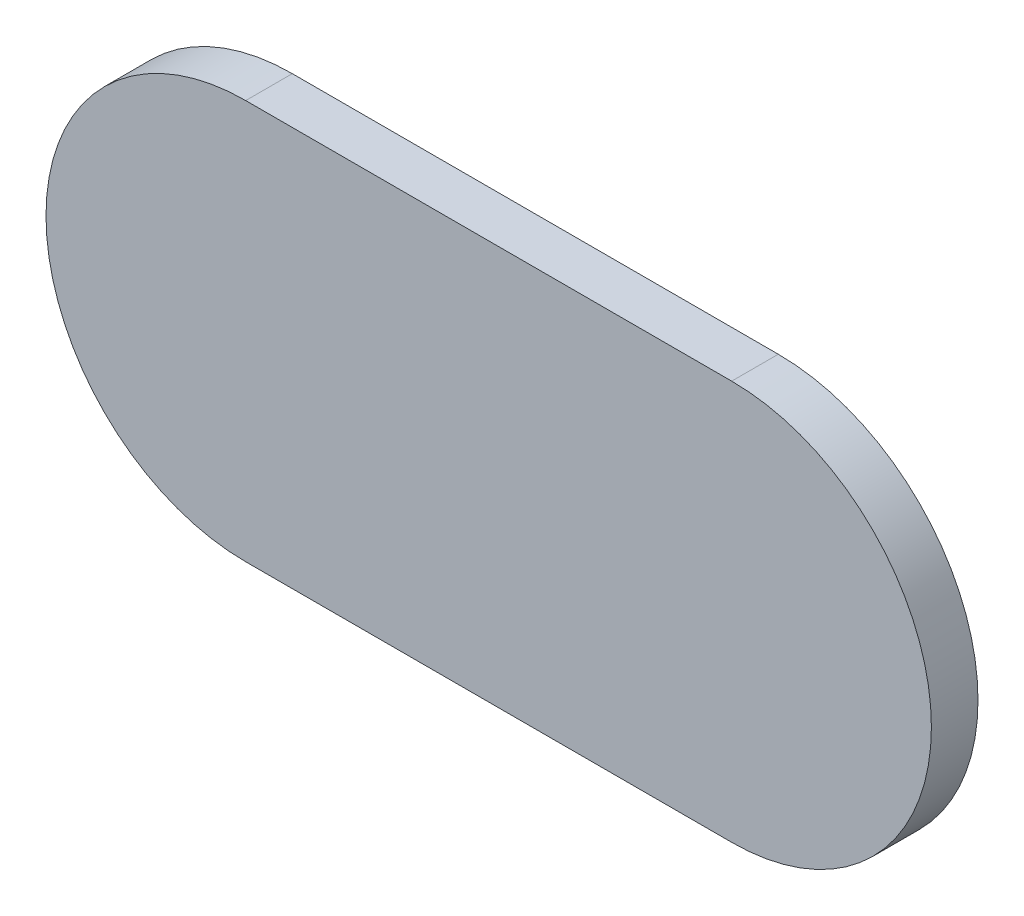
ISO-10303-21;
HEADER;
FILE_DESCRIPTION(('STEP AP214'),'2;1');
FILE_NAME('part.step','',(''),(''),'','','');
FILE_SCHEMA(('AUTOMOTIVE_DESIGN { 1 0 10303 214 1 1 1 1 }'));
ENDSEC;
DATA;
#1=APPLICATION_CONTEXT('core data for automotive mechanical design processes');
#2=APPLICATION_PROTOCOL_DEFINITION('international standard','automotive_design',2000,#1);
#3=PRODUCT_CONTEXT('',#1,'mechanical');
#4=PRODUCT('Part','Part','',(#3));
#5=PRODUCT_RELATED_PRODUCT_CATEGORY('part','',(#4));
#6=PRODUCT_DEFINITION_FORMATION('','',#4);
#7=PRODUCT_DEFINITION_CONTEXT('part definition',#1,'design');
#8=PRODUCT_DEFINITION('design','',#6,#7);
#9=PRODUCT_DEFINITION_SHAPE('','',#8);
#10=(LENGTH_UNIT() NAMED_UNIT(*) SI_UNIT(.MILLI.,.METRE.));
#11=(NAMED_UNIT(*) PLANE_ANGLE_UNIT() SI_UNIT($,.RADIAN.));
#12=(NAMED_UNIT(*) SI_UNIT($,.STERADIAN.) SOLID_ANGLE_UNIT());
#13=UNCERTAINTY_MEASURE_WITH_UNIT(LENGTH_MEASURE(1.E-05),#10,'distance_accuracy_value','');
#14=(GEOMETRIC_REPRESENTATION_CONTEXT(3) GLOBAL_UNCERTAINTY_ASSIGNED_CONTEXT((#13)) GLOBAL_UNIT_ASSIGNED_CONTEXT((#10,
#11,#12)) REPRESENTATION_CONTEXT('',''));
#15=CARTESIAN_POINT('',(0.,0.,0.));
#16=DIRECTION('',(0.,0.,1.));
#17=DIRECTION('',(1.,0.,0.));
#18=AXIS2_PLACEMENT_3D('',#15,#16,#17);
#19=CARTESIAN_POINT('',(85.365,-131.215,1.635));
#20=DIRECTION('',(0.,0.,1.));
#21=DIRECTION('',(1.,0.,0.));
#22=AXIS2_PLACEMENT_3D('',#19,#20,#21);
#23=PLANE('',#22);
#24=DIRECTION('',(-1.,0.,0.));
#25=VECTOR('',#24,1.);
#26=CARTESIAN_POINT('',(85.365,-131.215,1.635));
#27=LINE('',#26,#25);
#28=CARTESIAN_POINT('',(85.365,-131.215,1.635));
#29=VERTEX_POINT('',#28);
#30=CARTESIAN_POINT('',(85.,-131.215,1.635));
#31=VERTEX_POINT('',#30);
#32=EDGE_CURVE('E82',#29,#31,#27,.T.);
#33=ORIENTED_EDGE('',*,*,#32,.T.);
#34=CARTESIAN_POINT('',(85.,-131.365,1.635));
#35=DIRECTION('',(0.,0.,1.));
#36=DIRECTION('',(1.894780628694E-13,1.,0.));
#37=AXIS2_PLACEMENT_3D('',#34,#35,#36);
#38=CIRCLE('',#37,0.15);
#39=CARTESIAN_POINT('',(85.,-131.515,1.635));
#40=VERTEX_POINT('',#39);
#41=EDGE_CURVE('E106',#31,#40,#38,.T.);
#42=ORIENTED_EDGE('',*,*,#41,.T.);
#43=DIRECTION('',(1.,0.,0.));
#44=VECTOR('',#43,1.);
#45=CARTESIAN_POINT('',(85.,-131.515,1.635));
#46=LINE('',#45,#44);
#47=CARTESIAN_POINT('',(85.365,-131.515,1.635));
#48=VERTEX_POINT('',#47);
#49=EDGE_CURVE('E74',#40,#48,#46,.T.);
#50=ORIENTED_EDGE('',*,*,#49,.T.);
#51=CARTESIAN_POINT('',(85.365,-131.365,1.635));
#52=DIRECTION('',(0.,0.,1.));
#53=DIRECTION('',(0.,-1.,0.));
#54=AXIS2_PLACEMENT_3D('',#51,#52,#53);
#55=CIRCLE('',#54,0.15);
#56=EDGE_CURVE('E11',#48,#29,#55,.T.);
#57=ORIENTED_EDGE('',*,*,#56,.T.);
#58=EDGE_LOOP('',(#33,#42,#50,#57));
#59=FACE_BOUND('',#58,.T.);
#60=ADVANCED_FACE('F17',(#59),#23,.T.);
#61=CARTESIAN_POINT('',(85.365,-131.215,1.6));
#62=DIRECTION('',(0.,0.,1.));
#63=DIRECTION('',(1.,0.,0.));
#64=AXIS2_PLACEMENT_3D('',#61,#62,#63);
#65=PLANE('',#64);
#66=CARTESIAN_POINT('',(85.365,-131.365,1.6));
#67=DIRECTION('',(0.,0.,1.));
#68=DIRECTION('',(0.,-1.,0.));
#69=AXIS2_PLACEMENT_3D('',#66,#67,#68);
#70=CIRCLE('',#69,0.15);
#71=CARTESIAN_POINT('',(85.365,-131.515,1.6));
#72=VERTEX_POINT('',#71);
#73=CARTESIAN_POINT('',(85.365,-131.215,1.6));
#74=VERTEX_POINT('',#73);
#75=EDGE_CURVE('E25',#72,#74,#70,.T.);
#76=ORIENTED_EDGE('',*,*,#75,.F.);
#77=DIRECTION('',(1.,0.,0.));
#78=VECTOR('',#77,1.);
#79=CARTESIAN_POINT('',(85.,-131.515,1.6));
#80=LINE('',#79,#78);
#81=CARTESIAN_POINT('',(85.,-131.515,1.6));
#82=VERTEX_POINT('',#81);
#83=EDGE_CURVE('E110',#82,#72,#80,.T.);
#84=ORIENTED_EDGE('',*,*,#83,.F.);
#85=CARTESIAN_POINT('',(85.,-131.365,1.6));
#86=DIRECTION('',(0.,0.,1.));
#87=DIRECTION('',(1.894780628694E-13,1.,0.));
#88=AXIS2_PLACEMENT_3D('',#85,#86,#87);
#89=CIRCLE('',#88,0.15);
#90=CARTESIAN_POINT('',(85.,-131.215,1.6));
#91=VERTEX_POINT('',#90);
#92=EDGE_CURVE('E84',#91,#82,#89,.T.);
#93=ORIENTED_EDGE('',*,*,#92,.F.);
#94=DIRECTION('',(-1.,0.,0.));
#95=VECTOR('',#94,1.);
#96=CARTESIAN_POINT('',(85.365,-131.215,1.6));
#97=LINE('',#96,#95);
#98=EDGE_CURVE('E80',#74,#91,#97,.T.);
#99=ORIENTED_EDGE('',*,*,#98,.F.);
#100=EDGE_LOOP('',(#76,#84,#93,#99));
#101=FACE_BOUND('',#100,.T.);
#102=ADVANCED_FACE('F86',(#101),#65,.F.);
#103=CARTESIAN_POINT('',(85.365,-131.365,1.6));
#104=DIRECTION('',(0.,0.,-1.));
#105=DIRECTION('',(0.,-1.,0.));
#106=AXIS2_PLACEMENT_3D('',#103,#104,#105);
#107=CYLINDRICAL_SURFACE('',#106,0.15);
#108=ORIENTED_EDGE('',*,*,#75,.T.);
#109=DIRECTION('',(0.,0.,1.));
#110=VECTOR('',#109,1.);
#111=CARTESIAN_POINT('',(85.365,-131.215,1.6));
#112=LINE('',#111,#110);
#113=EDGE_CURVE('E68',#74,#29,#112,.T.);
#114=ORIENTED_EDGE('',*,*,#113,.T.);
#115=ORIENTED_EDGE('',*,*,#56,.F.);
#116=DIRECTION('',(0.,0.,1.));
#117=VECTOR('',#116,1.);
#118=CARTESIAN_POINT('',(85.365,-131.515,1.6));
#119=LINE('',#118,#117);
#120=EDGE_CURVE('E71',#72,#48,#119,.T.);
#121=ORIENTED_EDGE('',*,*,#120,.F.);
#122=EDGE_LOOP('',(#108,#114,#115,#121));
#123=FACE_BOUND('',#122,.T.);
#124=ADVANCED_FACE('F67',(#123),#107,.T.);
#125=CARTESIAN_POINT('',(85.,-131.515,1.6));
#126=DIRECTION('',(0.,1.,0.));
#127=DIRECTION('',(1.,0.,0.));
#128=AXIS2_PLACEMENT_3D('',#125,#126,#127);
#129=PLANE('',#128);
#130=ORIENTED_EDGE('',*,*,#83,.T.);
#131=ORIENTED_EDGE('',*,*,#120,.T.);
#132=ORIENTED_EDGE('',*,*,#49,.F.);
#133=DIRECTION('',(0.,0.,1.));
#134=VECTOR('',#133,1.);
#135=CARTESIAN_POINT('',(85.,-131.515,1.6));
#136=LINE('',#135,#134);
#137=EDGE_CURVE('E102',#82,#40,#136,.T.);
#138=ORIENTED_EDGE('',*,*,#137,.F.);
#139=EDGE_LOOP('',(#130,#131,#132,#138));
#140=FACE_BOUND('',#139,.T.);
#141=ADVANCED_FACE('F118',(#140),#129,.F.);
#142=CARTESIAN_POINT('',(85.,-131.365,1.6));
#143=DIRECTION('',(0.,0.,-1.));
#144=DIRECTION('',(1.894780628694E-13,1.,0.));
#145=AXIS2_PLACEMENT_3D('',#142,#143,#144);
#146=CYLINDRICAL_SURFACE('',#145,0.15);
#147=ORIENTED_EDGE('',*,*,#92,.T.);
#148=ORIENTED_EDGE('',*,*,#137,.T.);
#149=ORIENTED_EDGE('',*,*,#41,.F.);
#150=DIRECTION('',(0.,0.,1.));
#151=VECTOR('',#150,1.);
#152=CARTESIAN_POINT('',(85.,-131.215,1.6));
#153=LINE('',#152,#151);
#154=EDGE_CURVE('E90',#91,#31,#153,.T.);
#155=ORIENTED_EDGE('',*,*,#154,.F.);
#156=EDGE_LOOP('',(#147,#148,#149,#155));
#157=FACE_BOUND('',#156,.T.);
#158=ADVANCED_FACE('F121',(#157),#146,.T.);
#159=CARTESIAN_POINT('',(85.365,-131.215,1.6));
#160=DIRECTION('',(0.,-1.,0.));
#161=DIRECTION('',(0.,0.,-1.));
#162=AXIS2_PLACEMENT_3D('',#159,#160,#161);
#163=PLANE('',#162);
#164=ORIENTED_EDGE('',*,*,#98,.T.);
#165=ORIENTED_EDGE('',*,*,#154,.T.);
#166=ORIENTED_EDGE('',*,*,#32,.F.);
#167=ORIENTED_EDGE('',*,*,#113,.F.);
#168=EDGE_LOOP('',(#164,#165,#166,#167));
#169=FACE_BOUND('',#168,.T.);
#170=ADVANCED_FACE('F78',(#169),#163,.F.);
#171=CLOSED_SHELL('',(#60,#102,#124,#141,#158,#170));
#172=MANIFOLD_SOLID_BREP('B1',#171);
#173=ADVANCED_BREP_SHAPE_REPRESENTATION('',(#18,#172),#14);
#174=SHAPE_DEFINITION_REPRESENTATION(#9,#173);
ENDSEC;
END-ISO-10303-21;
